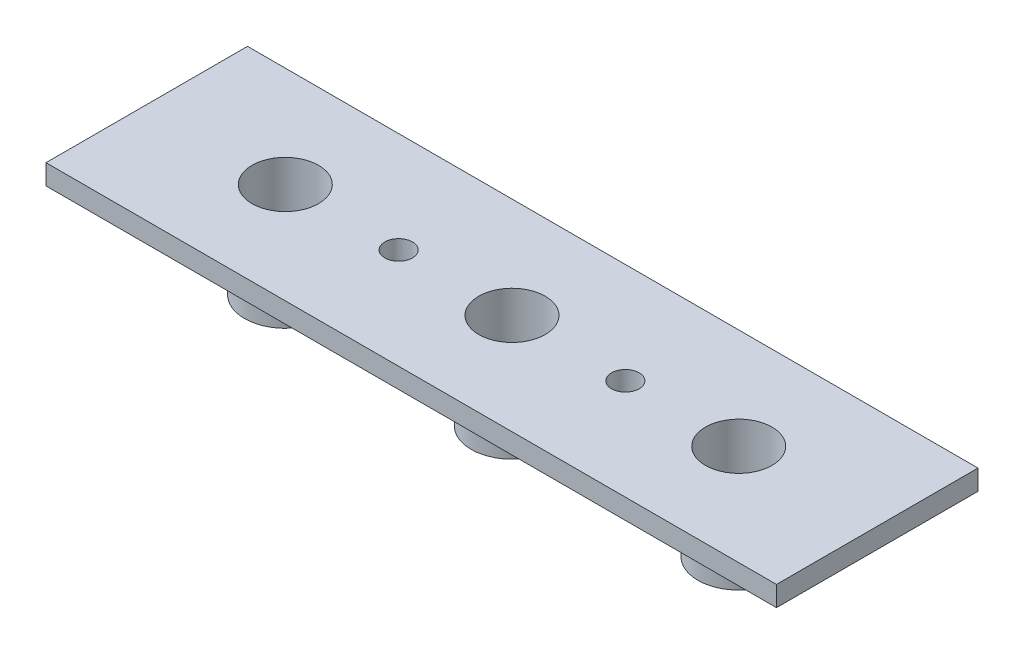
ISO-10303-21;
HEADER;
FILE_DESCRIPTION(('STEP AP214'),'2;1');
FILE_NAME('part.step','',(''),(''),'','','');
FILE_SCHEMA(('AUTOMOTIVE_DESIGN { 1 0 10303 214 1 1 1 1 }'));
ENDSEC;
DATA;
#1=APPLICATION_CONTEXT('core data for automotive mechanical design processes');
#2=APPLICATION_PROTOCOL_DEFINITION('international standard','automotive_design',2000,#1);
#3=PRODUCT_CONTEXT('',#1,'mechanical');
#4=PRODUCT('Part','Part','',(#3));
#5=PRODUCT_RELATED_PRODUCT_CATEGORY('part','',(#4));
#6=PRODUCT_DEFINITION_FORMATION('','',#4);
#7=PRODUCT_DEFINITION_CONTEXT('part definition',#1,'design');
#8=PRODUCT_DEFINITION('design','',#6,#7);
#9=PRODUCT_DEFINITION_SHAPE('','',#8);
#10=(LENGTH_UNIT() NAMED_UNIT(*) SI_UNIT(.MILLI.,.METRE.));
#11=(NAMED_UNIT(*) PLANE_ANGLE_UNIT() SI_UNIT($,.RADIAN.));
#12=(NAMED_UNIT(*) SI_UNIT($,.STERADIAN.) SOLID_ANGLE_UNIT());
#13=UNCERTAINTY_MEASURE_WITH_UNIT(LENGTH_MEASURE(1.E-05),#10,'distance_accuracy_value','');
#14=(GEOMETRIC_REPRESENTATION_CONTEXT(3) GLOBAL_UNCERTAINTY_ASSIGNED_CONTEXT((#13)) GLOBAL_UNIT_ASSIGNED_CONTEXT((#10,
#11,#12)) REPRESENTATION_CONTEXT('',''));
#15=CARTESIAN_POINT('',(0.,0.,0.));
#16=DIRECTION('',(0.,0.,1.));
#17=DIRECTION('',(1.,0.,0.));
#18=AXIS2_PLACEMENT_3D('',#15,#16,#17);
#19=CARTESIAN_POINT('',(117.5,4.,0.));
#20=DIRECTION('',(1.,0.,0.));
#21=DIRECTION('',(0.,0.,-1.));
#22=AXIS2_PLACEMENT_3D('',#19,#20,#21);
#23=PLANE('',#22);
#24=DIRECTION('',(0.,0.,1.));
#25=VECTOR('',#24,1.);
#26=CARTESIAN_POINT('',(117.5,0.,0.));
#27=LINE('',#26,#25);
#28=CARTESIAN_POINT('',(117.5,0.,-20.));
#29=VERTEX_POINT('',#28);
#30=CARTESIAN_POINT('',(117.5,0.,20.));
#31=VERTEX_POINT('',#30);
#32=EDGE_CURVE('E119',#29,#31,#27,.T.);
#33=ORIENTED_EDGE('',*,*,#32,.F.);
#34=DIRECTION('',(0.,-1.,0.));
#35=VECTOR('',#34,1.);
#36=CARTESIAN_POINT('',(117.5,4.,-20.));
#37=LINE('',#36,#35);
#38=CARTESIAN_POINT('',(117.5,4.,-20.));
#39=VERTEX_POINT('',#38);
#40=EDGE_CURVE('E11',#39,#29,#37,.T.);
#41=ORIENTED_EDGE('',*,*,#40,.F.);
#42=DIRECTION('',(0.,0.,1.));
#43=VECTOR('',#42,1.);
#44=CARTESIAN_POINT('',(117.5,4.,0.));
#45=LINE('',#44,#43);
#46=CARTESIAN_POINT('',(117.5,4.,20.));
#47=VERTEX_POINT('',#46);
#48=EDGE_CURVE('E109',#39,#47,#45,.T.);
#49=ORIENTED_EDGE('',*,*,#48,.T.);
#50=DIRECTION('',(0.,-1.,0.));
#51=VECTOR('',#50,1.);
#52=CARTESIAN_POINT('',(117.5,4.,20.));
#53=LINE('',#52,#51);
#54=EDGE_CURVE('E86',#47,#31,#53,.T.);
#55=ORIENTED_EDGE('',*,*,#54,.T.);
#56=EDGE_LOOP('',(#33,#41,#49,#55));
#57=FACE_BOUND('',#56,.T.);
#58=ADVANCED_FACE('F45',(#57),#23,.T.);
#59=CARTESIAN_POINT('',(0.,4.,-20.));
#60=DIRECTION('',(0.,0.,-1.));
#61=DIRECTION('',(-1.,0.,0.));
#62=AXIS2_PLACEMENT_3D('',#59,#60,#61);
#63=PLANE('',#62);
#64=DIRECTION('',(1.,0.,0.));
#65=VECTOR('',#64,1.);
#66=CARTESIAN_POINT('',(0.,0.,-20.));
#67=LINE('',#66,#65);
#68=CARTESIAN_POINT('',(-27.5,0.,-20.));
#69=VERTEX_POINT('',#68);
#70=EDGE_CURVE('E98',#69,#29,#67,.T.);
#71=ORIENTED_EDGE('',*,*,#70,.F.);
#72=DIRECTION('',(0.,-1.,0.));
#73=VECTOR('',#72,1.);
#74=CARTESIAN_POINT('',(-27.5,4.,-20.));
#75=LINE('',#74,#73);
#76=CARTESIAN_POINT('',(-27.5,4.,-20.));
#77=VERTEX_POINT('',#76);
#78=EDGE_CURVE('E55',#77,#69,#75,.T.);
#79=ORIENTED_EDGE('',*,*,#78,.F.);
#80=DIRECTION('',(1.,0.,0.));
#81=VECTOR('',#80,1.);
#82=CARTESIAN_POINT('',(0.,4.,-20.));
#83=LINE('',#82,#81);
#84=EDGE_CURVE('E96',#77,#39,#83,.T.);
#85=ORIENTED_EDGE('',*,*,#84,.T.);
#86=ORIENTED_EDGE('',*,*,#40,.T.);
#87=EDGE_LOOP('',(#71,#79,#85,#86));
#88=FACE_BOUND('',#87,.T.);
#89=ADVANCED_FACE('F94',(#88),#63,.T.);
#90=CARTESIAN_POINT('',(-27.5,4.,0.));
#91=DIRECTION('',(1.,0.,0.));
#92=DIRECTION('',(0.,0.,-1.));
#93=AXIS2_PLACEMENT_3D('',#90,#91,#92);
#94=PLANE('',#93);
#95=DIRECTION('',(0.,0.,1.));
#96=VECTOR('',#95,1.);
#97=CARTESIAN_POINT('',(-27.5,0.,0.));
#98=LINE('',#97,#96);
#99=CARTESIAN_POINT('',(-27.5,0.,20.));
#100=VERTEX_POINT('',#99);
#101=EDGE_CURVE('E125',#69,#100,#98,.T.);
#102=ORIENTED_EDGE('',*,*,#101,.T.);
#103=DIRECTION('',(0.,-1.,0.));
#104=VECTOR('',#103,1.);
#105=CARTESIAN_POINT('',(-27.5,4.,20.));
#106=LINE('',#105,#104);
#107=CARTESIAN_POINT('',(-27.5,4.,20.));
#108=VERTEX_POINT('',#107);
#109=EDGE_CURVE('E102',#108,#100,#106,.T.);
#110=ORIENTED_EDGE('',*,*,#109,.F.);
#111=DIRECTION('',(0.,0.,1.));
#112=VECTOR('',#111,1.);
#113=CARTESIAN_POINT('',(-27.5,4.,0.));
#114=LINE('',#113,#112);
#115=EDGE_CURVE('E104',#77,#108,#114,.T.);
#116=ORIENTED_EDGE('',*,*,#115,.F.);
#117=ORIENTED_EDGE('',*,*,#78,.T.);
#118=EDGE_LOOP('',(#102,#110,#116,#117));
#119=FACE_BOUND('',#118,.T.);
#120=ADVANCED_FACE('F105',(#119),#94,.F.);
#121=CARTESIAN_POINT('',(0.,4.,0.));
#122=DIRECTION('',(0.,-1.,0.));
#123=DIRECTION('',(0.,0.,-1.));
#124=AXIS2_PLACEMENT_3D('',#121,#122,#123);
#125=CYLINDRICAL_SURFACE('',#124,6.6);
#126=CARTESIAN_POINT('',(0.,4.,0.));
#127=DIRECTION('',(0.,1.,0.));
#128=DIRECTION('',(0.,0.,1.));
#129=AXIS2_PLACEMENT_3D('',#126,#127,#128);
#130=CIRCLE('',#129,6.6);
#131=CARTESIAN_POINT('',(0.,4.,6.6));
#132=VERTEX_POINT('',#131);
#133=EDGE_CURVE('E113',#132,#132,#130,.T.);
#134=ORIENTED_EDGE('',*,*,#133,.T.);
#135=EDGE_LOOP('',(#134));
#136=FACE_BOUND('',#135,.T.);
#137=CARTESIAN_POINT('',(0.,-15.,0.));
#138=DIRECTION('',(0.,1.,0.));
#139=DIRECTION('',(0.,0.,1.));
#140=AXIS2_PLACEMENT_3D('',#137,#138,#139);
#141=CIRCLE('',#140,6.6);
#142=CARTESIAN_POINT('',(0.,-15.,6.6));
#143=VERTEX_POINT('',#142);
#144=EDGE_CURVE('E170',#143,#143,#141,.T.);
#145=ORIENTED_EDGE('',*,*,#144,.F.);
#146=EDGE_LOOP('',(#145));
#147=FACE_BOUND('',#146,.T.);
#148=ADVANCED_FACE('F145',(#136,#147),#125,.F.);
#149=CARTESIAN_POINT('',(45.,4.,0.));
#150=DIRECTION('',(0.,-1.,0.));
#151=DIRECTION('',(0.,0.,-1.));
#152=AXIS2_PLACEMENT_3D('',#149,#150,#151);
#153=CYLINDRICAL_SURFACE('',#152,6.6);
#154=CARTESIAN_POINT('',(45.,4.,0.));
#155=DIRECTION('',(0.,1.,0.));
#156=DIRECTION('',(0.,0.,1.));
#157=AXIS2_PLACEMENT_3D('',#154,#155,#156);
#158=CIRCLE('',#157,6.6);
#159=CARTESIAN_POINT('',(45.,4.,6.6));
#160=VERTEX_POINT('',#159);
#161=EDGE_CURVE('E158',#160,#160,#158,.T.);
#162=ORIENTED_EDGE('',*,*,#161,.T.);
#163=EDGE_LOOP('',(#162));
#164=FACE_BOUND('',#163,.T.);
#165=CARTESIAN_POINT('',(45.,-15.,0.));
#166=DIRECTION('',(0.,1.,0.));
#167=DIRECTION('',(0.,0.,1.));
#168=AXIS2_PLACEMENT_3D('',#165,#166,#167);
#169=CIRCLE('',#168,6.6);
#170=CARTESIAN_POINT('',(45.,-15.,6.6));
#171=VERTEX_POINT('',#170);
#172=EDGE_CURVE('E161',#171,#171,#169,.T.);
#173=ORIENTED_EDGE('',*,*,#172,.F.);
#174=EDGE_LOOP('',(#173));
#175=FACE_BOUND('',#174,.T.);
#176=ADVANCED_FACE('F147',(#164,#175),#153,.F.);
#177=CARTESIAN_POINT('',(90.,4.,0.));
#178=DIRECTION('',(0.,-1.,0.));
#179=DIRECTION('',(0.,0.,-1.));
#180=AXIS2_PLACEMENT_3D('',#177,#178,#179);
#181=CYLINDRICAL_SURFACE('',#180,6.59999999999999);
#182=CARTESIAN_POINT('',(90.,4.,0.));
#183=DIRECTION('',(0.,1.,0.));
#184=DIRECTION('',(0.,0.,1.));
#185=AXIS2_PLACEMENT_3D('',#182,#183,#184);
#186=CIRCLE('',#185,6.59999999999999);
#187=CARTESIAN_POINT('',(90.,4.,6.59999999999998));
#188=VERTEX_POINT('',#187);
#189=EDGE_CURVE('E130',#188,#188,#186,.T.);
#190=ORIENTED_EDGE('',*,*,#189,.T.);
#191=EDGE_LOOP('',(#190));
#192=FACE_BOUND('',#191,.T.);
#193=CARTESIAN_POINT('',(90.,-15.,0.));
#194=DIRECTION('',(0.,1.,0.));
#195=DIRECTION('',(0.,0.,1.));
#196=AXIS2_PLACEMENT_3D('',#193,#194,#195);
#197=CIRCLE('',#196,6.59999999999999);
#198=CARTESIAN_POINT('',(90.,-15.,6.59999999999998));
#199=VERTEX_POINT('',#198);
#200=EDGE_CURVE('E180',#199,#199,#197,.T.);
#201=ORIENTED_EDGE('',*,*,#200,.F.);
#202=EDGE_LOOP('',(#201));
#203=FACE_BOUND('',#202,.T.);
#204=ADVANCED_FACE('F47',(#192,#203),#181,.F.);
#205=CARTESIAN_POINT('',(0.,4.,20.));
#206=DIRECTION('',(0.,0.,-1.));
#207=DIRECTION('',(-1.,0.,0.));
#208=AXIS2_PLACEMENT_3D('',#205,#206,#207);
#209=PLANE('',#208);
#210=DIRECTION('',(1.,0.,0.));
#211=VECTOR('',#210,1.);
#212=CARTESIAN_POINT('',(0.,0.,20.));
#213=LINE('',#212,#211);
#214=EDGE_CURVE('E79',#100,#31,#213,.T.);
#215=ORIENTED_EDGE('',*,*,#214,.T.);
#216=ORIENTED_EDGE('',*,*,#54,.F.);
#217=DIRECTION('',(1.,0.,0.));
#218=VECTOR('',#217,1.);
#219=CARTESIAN_POINT('',(0.,4.,20.));
#220=LINE('',#219,#218);
#221=EDGE_CURVE('E63',#108,#47,#220,.T.);
#222=ORIENTED_EDGE('',*,*,#221,.F.);
#223=ORIENTED_EDGE('',*,*,#109,.T.);
#224=EDGE_LOOP('',(#215,#216,#222,#223));
#225=FACE_BOUND('',#224,.T.);
#226=ADVANCED_FACE('F135',(#225),#209,.F.);
#227=CARTESIAN_POINT('',(0.,4.,0.));
#228=DIRECTION('',(0.,1.,0.));
#229=DIRECTION('',(0.,0.,1.));
#230=AXIS2_PLACEMENT_3D('',#227,#228,#229);
#231=PLANE('',#230);
#232=CARTESIAN_POINT('',(22.5,4.,0.));
#233=DIRECTION('',(0.,1.,0.));
#234=DIRECTION('',(0.,0.,1.));
#235=AXIS2_PLACEMENT_3D('',#232,#233,#234);
#236=CIRCLE('',#235,2.75);
#237=CARTESIAN_POINT('',(22.5,4.,2.75));
#238=VERTEX_POINT('',#237);
#239=EDGE_CURVE('E447',#238,#238,#236,.T.);
#240=ORIENTED_EDGE('',*,*,#239,.F.);
#241=EDGE_LOOP('',(#240));
#242=FACE_BOUND('',#241,.T.);
#243=CARTESIAN_POINT('',(67.5,4.,0.));
#244=DIRECTION('',(0.,1.,0.));
#245=DIRECTION('',(0.,0.,1.));
#246=AXIS2_PLACEMENT_3D('',#243,#244,#245);
#247=CIRCLE('',#246,2.74999999999999);
#248=CARTESIAN_POINT('',(67.5,4.,2.74999999999999));
#249=VERTEX_POINT('',#248);
#250=EDGE_CURVE('E452',#249,#249,#247,.T.);
#251=ORIENTED_EDGE('',*,*,#250,.F.);
#252=EDGE_LOOP('',(#251));
#253=FACE_BOUND('',#252,.T.);
#254=ORIENTED_EDGE('',*,*,#189,.F.);
#255=EDGE_LOOP('',(#254));
#256=FACE_BOUND('',#255,.T.);
#257=ORIENTED_EDGE('',*,*,#161,.F.);
#258=EDGE_LOOP('',(#257));
#259=FACE_BOUND('',#258,.T.);
#260=ORIENTED_EDGE('',*,*,#133,.F.);
#261=EDGE_LOOP('',(#260));
#262=FACE_BOUND('',#261,.T.);
#263=ORIENTED_EDGE('',*,*,#48,.F.);
#264=ORIENTED_EDGE('',*,*,#84,.F.);
#265=ORIENTED_EDGE('',*,*,#115,.T.);
#266=ORIENTED_EDGE('',*,*,#221,.T.);
#267=EDGE_LOOP('',(#263,#264,#265,#266));
#268=FACE_BOUND('',#267,.T.);
#269=ADVANCED_FACE('F108',(#242,#253,#256,#259,#262,#268),#231,.T.);
#270=CARTESIAN_POINT('',(0.,0.,0.));
#271=DIRECTION('',(0.,1.,0.));
#272=DIRECTION('',(0.,0.,1.));
#273=AXIS2_PLACEMENT_3D('',#270,#271,#272);
#274=PLANE('',#273);
#275=CARTESIAN_POINT('',(22.5,0.,0.));
#276=DIRECTION('',(0.,-1.,0.));
#277=DIRECTION('',(0.,0.,-1.));
#278=AXIS2_PLACEMENT_3D('',#275,#276,#277);
#279=CIRCLE('',#278,2.75);
#280=CARTESIAN_POINT('',(22.5,0.,-2.75));
#281=VERTEX_POINT('',#280);
#282=EDGE_CURVE('E450',#281,#281,#279,.T.);
#283=ORIENTED_EDGE('',*,*,#282,.F.);
#284=EDGE_LOOP('',(#283));
#285=FACE_BOUND('',#284,.T.);
#286=CARTESIAN_POINT('',(67.5,0.,0.));
#287=DIRECTION('',(0.,-1.,0.));
#288=DIRECTION('',(0.,0.,-1.));
#289=AXIS2_PLACEMENT_3D('',#286,#287,#288);
#290=CIRCLE('',#289,2.74999999999999);
#291=CARTESIAN_POINT('',(67.5,0.,-2.75));
#292=VERTEX_POINT('',#291);
#293=EDGE_CURVE('E453',#292,#292,#290,.T.);
#294=ORIENTED_EDGE('',*,*,#293,.F.);
#295=EDGE_LOOP('',(#294));
#296=FACE_BOUND('',#295,.T.);
#297=CARTESIAN_POINT('',(90.,0.,0.));
#298=DIRECTION('',(0.,1.,0.));
#299=DIRECTION('',(0.,0.,1.));
#300=AXIS2_PLACEMENT_3D('',#297,#298,#299);
#301=CIRCLE('',#300,8.10000000000001);
#302=CARTESIAN_POINT('',(90.,0.,8.1));
#303=VERTEX_POINT('',#302);
#304=EDGE_CURVE('E464',#303,#303,#301,.T.);
#305=ORIENTED_EDGE('',*,*,#304,.T.);
#306=EDGE_LOOP('',(#305));
#307=FACE_BOUND('',#306,.T.);
#308=CARTESIAN_POINT('',(45.,0.,0.));
#309=DIRECTION('',(0.,1.,0.));
#310=DIRECTION('',(0.,0.,1.));
#311=AXIS2_PLACEMENT_3D('',#308,#309,#310);
#312=CIRCLE('',#311,8.1);
#313=CARTESIAN_POINT('',(45.,0.,8.09999999999999));
#314=VERTEX_POINT('',#313);
#315=EDGE_CURVE('E173',#314,#314,#312,.T.);
#316=ORIENTED_EDGE('',*,*,#315,.T.);
#317=EDGE_LOOP('',(#316));
#318=FACE_BOUND('',#317,.T.);
#319=CARTESIAN_POINT('',(0.,0.,0.));
#320=DIRECTION('',(0.,1.,0.));
#321=DIRECTION('',(0.,0.,1.));
#322=AXIS2_PLACEMENT_3D('',#319,#320,#321);
#323=CIRCLE('',#322,8.1);
#324=CARTESIAN_POINT('',(0.,0.,8.1));
#325=VERTEX_POINT('',#324);
#326=EDGE_CURVE('E164',#325,#325,#323,.T.);
#327=ORIENTED_EDGE('',*,*,#326,.T.);
#328=EDGE_LOOP('',(#327));
#329=FACE_BOUND('',#328,.T.);
#330=ORIENTED_EDGE('',*,*,#32,.T.);
#331=ORIENTED_EDGE('',*,*,#214,.F.);
#332=ORIENTED_EDGE('',*,*,#101,.F.);
#333=ORIENTED_EDGE('',*,*,#70,.T.);
#334=EDGE_LOOP('',(#330,#331,#332,#333));
#335=FACE_BOUND('',#334,.T.);
#336=ADVANCED_FACE('F136',(#285,#296,#307,#318,#329,#335),#274,.F.);
#337=CARTESIAN_POINT('',(0.,-15.,0.));
#338=DIRECTION('',(0.,1.,0.));
#339=DIRECTION('',(0.,0.,1.));
#340=AXIS2_PLACEMENT_3D('',#337,#338,#339);
#341=CYLINDRICAL_SURFACE('',#340,8.1);
#342=CARTESIAN_POINT('',(0.,-15.,0.));
#343=DIRECTION('',(0.,1.,0.));
#344=DIRECTION('',(0.,0.,1.));
#345=AXIS2_PLACEMENT_3D('',#342,#343,#344);
#346=CIRCLE('',#345,8.1);
#347=CARTESIAN_POINT('',(0.,-15.,8.1));
#348=VERTEX_POINT('',#347);
#349=EDGE_CURVE('E122',#348,#348,#346,.T.);
#350=ORIENTED_EDGE('',*,*,#349,.T.);
#351=EDGE_LOOP('',(#350));
#352=FACE_BOUND('',#351,.T.);
#353=ORIENTED_EDGE('',*,*,#326,.F.);
#354=EDGE_LOOP('',(#353));
#355=FACE_BOUND('',#354,.T.);
#356=ADVANCED_FACE('F203',(#352,#355),#341,.T.);
#357=CARTESIAN_POINT('',(0.,-15.,0.));
#358=DIRECTION('',(0.,1.,0.));
#359=DIRECTION('',(0.,0.,1.));
#360=AXIS2_PLACEMENT_3D('',#357,#358,#359);
#361=PLANE('',#360);
#362=ORIENTED_EDGE('',*,*,#144,.T.);
#363=EDGE_LOOP('',(#362));
#364=FACE_BOUND('',#363,.T.);
#365=ORIENTED_EDGE('',*,*,#349,.F.);
#366=EDGE_LOOP('',(#365));
#367=FACE_BOUND('',#366,.T.);
#368=ADVANCED_FACE('F246',(#364,#367),#361,.F.);
#369=CARTESIAN_POINT('',(45.,-15.,0.));
#370=DIRECTION('',(0.,1.,0.));
#371=DIRECTION('',(0.,0.,1.));
#372=AXIS2_PLACEMENT_3D('',#369,#370,#371);
#373=CYLINDRICAL_SURFACE('',#372,8.1);
#374=CARTESIAN_POINT('',(45.,-15.,0.));
#375=DIRECTION('',(0.,1.,0.));
#376=DIRECTION('',(0.,0.,1.));
#377=AXIS2_PLACEMENT_3D('',#374,#375,#376);
#378=CIRCLE('',#377,8.1);
#379=CARTESIAN_POINT('',(45.,-15.,8.09999999999999));
#380=VERTEX_POINT('',#379);
#381=EDGE_CURVE('E165',#380,#380,#378,.T.);
#382=ORIENTED_EDGE('',*,*,#381,.T.);
#383=EDGE_LOOP('',(#382));
#384=FACE_BOUND('',#383,.T.);
#385=ORIENTED_EDGE('',*,*,#315,.F.);
#386=EDGE_LOOP('',(#385));
#387=FACE_BOUND('',#386,.T.);
#388=ADVANCED_FACE('F257',(#384,#387),#373,.T.);
#389=CARTESIAN_POINT('',(0.,-15.,0.));
#390=DIRECTION('',(0.,1.,0.));
#391=DIRECTION('',(0.,0.,1.));
#392=AXIS2_PLACEMENT_3D('',#389,#390,#391);
#393=PLANE('',#392);
#394=ORIENTED_EDGE('',*,*,#381,.F.);
#395=EDGE_LOOP('',(#394));
#396=FACE_BOUND('',#395,.T.);
#397=ORIENTED_EDGE('',*,*,#172,.T.);
#398=EDGE_LOOP('',(#397));
#399=FACE_BOUND('',#398,.T.);
#400=ADVANCED_FACE('F266',(#396,#399),#393,.F.);
#401=CARTESIAN_POINT('',(90.,-15.,0.));
#402=DIRECTION('',(0.,1.,0.));
#403=DIRECTION('',(0.,0.,1.));
#404=AXIS2_PLACEMENT_3D('',#401,#402,#403);
#405=CYLINDRICAL_SURFACE('',#404,8.10000000000001);
#406=CARTESIAN_POINT('',(90.,-15.,0.));
#407=DIRECTION('',(0.,1.,0.));
#408=DIRECTION('',(0.,0.,1.));
#409=AXIS2_PLACEMENT_3D('',#406,#407,#408);
#410=CIRCLE('',#409,8.10000000000001);
#411=CARTESIAN_POINT('',(90.,-15.,8.1));
#412=VERTEX_POINT('',#411);
#413=EDGE_CURVE('E465',#412,#412,#410,.T.);
#414=ORIENTED_EDGE('',*,*,#413,.T.);
#415=EDGE_LOOP('',(#414));
#416=FACE_BOUND('',#415,.T.);
#417=ORIENTED_EDGE('',*,*,#304,.F.);
#418=EDGE_LOOP('',(#417));
#419=FACE_BOUND('',#418,.T.);
#420=ADVANCED_FACE('F278',(#416,#419),#405,.T.);
#421=CARTESIAN_POINT('',(0.,-15.,0.));
#422=DIRECTION('',(0.,1.,0.));
#423=DIRECTION('',(0.,0.,1.));
#424=AXIS2_PLACEMENT_3D('',#421,#422,#423);
#425=PLANE('',#424);
#426=ORIENTED_EDGE('',*,*,#413,.F.);
#427=EDGE_LOOP('',(#426));
#428=FACE_BOUND('',#427,.T.);
#429=ORIENTED_EDGE('',*,*,#200,.T.);
#430=EDGE_LOOP('',(#429));
#431=FACE_BOUND('',#430,.T.);
#432=ADVANCED_FACE('F289',(#428,#431),#425,.F.);
#433=CARTESIAN_POINT('',(67.5,74.,0.));
#434=DIRECTION('',(0.,-1.,0.));
#435=DIRECTION('',(0.,0.,-1.));
#436=AXIS2_PLACEMENT_3D('',#433,#434,#435);
#437=CYLINDRICAL_SURFACE('',#436,2.74999999999999);
#438=ORIENTED_EDGE('',*,*,#250,.T.);
#439=EDGE_LOOP('',(#438));
#440=FACE_BOUND('',#439,.T.);
#441=ORIENTED_EDGE('',*,*,#293,.T.);
#442=EDGE_LOOP('',(#441));
#443=FACE_BOUND('',#442,.T.);
#444=ADVANCED_FACE('F300',(#440,#443),#437,.F.);
#445=CARTESIAN_POINT('',(22.5,74.,0.));
#446=DIRECTION('',(0.,-1.,0.));
#447=DIRECTION('',(0.,0.,-1.));
#448=AXIS2_PLACEMENT_3D('',#445,#446,#447);
#449=CYLINDRICAL_SURFACE('',#448,2.75);
#450=ORIENTED_EDGE('',*,*,#239,.T.);
#451=EDGE_LOOP('',(#450));
#452=FACE_BOUND('',#451,.T.);
#453=ORIENTED_EDGE('',*,*,#282,.T.);
#454=EDGE_LOOP('',(#453));
#455=FACE_BOUND('',#454,.T.);
#456=ADVANCED_FACE('F323',(#452,#455),#449,.F.);
#457=CLOSED_SHELL('',(#58,#89,#120,#148,#176,#204,#226,#269,#336,#356,#368,#388,#400,#420,#432,
#444,#456));
#458=MANIFOLD_SOLID_BREP('B2',#457);
#459=ADVANCED_BREP_SHAPE_REPRESENTATION('',(#18,#458),#14);
#460=SHAPE_DEFINITION_REPRESENTATION(#9,#459);
ENDSEC;
END-ISO-10303-21;
